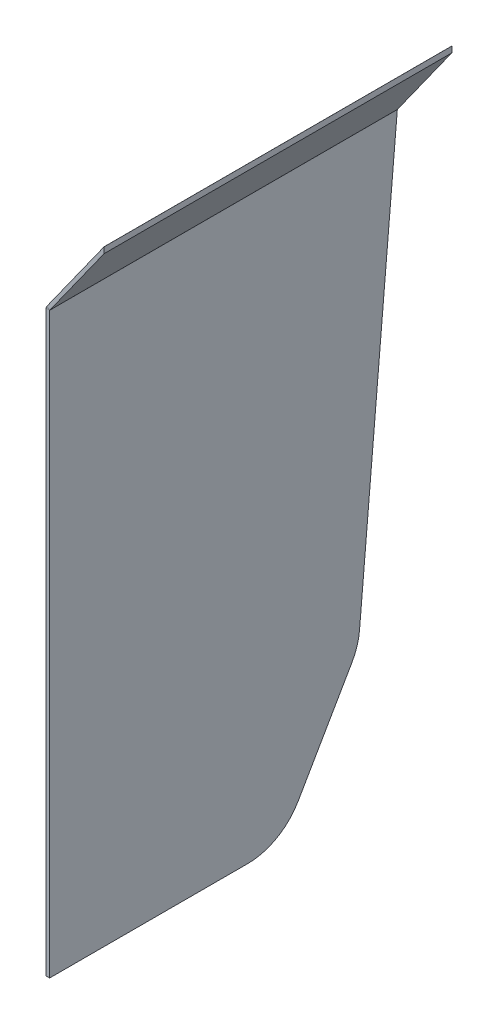
ISO-10303-21;
HEADER;
FILE_DESCRIPTION(('STEP AP214'),'2;1');
FILE_NAME('part.step','',(''),(''),'','','');
FILE_SCHEMA(('AUTOMOTIVE_DESIGN { 1 0 10303 214 1 1 1 1 }'));
ENDSEC;
DATA;
#1=APPLICATION_CONTEXT('core data for automotive mechanical design processes');
#2=APPLICATION_PROTOCOL_DEFINITION('international standard','automotive_design',2000,#1);
#3=PRODUCT_CONTEXT('',#1,'mechanical');
#4=PRODUCT('Part','Part','',(#3));
#5=PRODUCT_RELATED_PRODUCT_CATEGORY('part','',(#4));
#6=PRODUCT_DEFINITION_FORMATION('','',#4);
#7=PRODUCT_DEFINITION_CONTEXT('part definition',#1,'design');
#8=PRODUCT_DEFINITION('design','',#6,#7);
#9=PRODUCT_DEFINITION_SHAPE('','',#8);
#10=(LENGTH_UNIT() NAMED_UNIT(*) SI_UNIT(.MILLI.,.METRE.));
#11=(NAMED_UNIT(*) PLANE_ANGLE_UNIT() SI_UNIT($,.RADIAN.));
#12=(NAMED_UNIT(*) SI_UNIT($,.STERADIAN.) SOLID_ANGLE_UNIT());
#13=UNCERTAINTY_MEASURE_WITH_UNIT(LENGTH_MEASURE(1.E-05),#10,'distance_accuracy_value','');
#14=(GEOMETRIC_REPRESENTATION_CONTEXT(3) GLOBAL_UNCERTAINTY_ASSIGNED_CONTEXT((#13)) GLOBAL_UNIT_ASSIGNED_CONTEXT((#10,
#11,#12)) REPRESENTATION_CONTEXT('',''));
#15=CARTESIAN_POINT('',(0.,0.,0.));
#16=DIRECTION('',(0.,0.,1.));
#17=DIRECTION('',(1.,0.,0.));
#18=AXIS2_PLACEMENT_3D('',#15,#16,#17);
#19=CARTESIAN_POINT('',(0.577426239259121,0.80839673496277,150.));
#20=DIRECTION('',(0.,0.,1.));
#21=DIRECTION('',(1.,0.,0.));
#22=AXIS2_PLACEMENT_3D('',#19,#20,#21);
#23=PLANE('',#22);
#24=DIRECTION('',(0.813733471206735,-0.581238193719096,0.));
#25=VECTOR('',#24,1.);
#26=CARTESIAN_POINT('',(0.577426239259121,0.80839673496277,150.));
#27=LINE('',#26,#25);
#28=CARTESIAN_POINT('',(0.577426239259121,0.80839673496277,150.));
#29=VERTEX_POINT('',#28);
#30=CARTESIAN_POINT('',(3.01862665287933,-0.935317846194519,150.));
#31=VERTEX_POINT('',#30);
#32=EDGE_CURVE('E167',#29,#31,#27,.T.);
#33=ORIENTED_EDGE('',*,*,#32,.F.);
#34=CARTESIAN_POINT('',(3.1,-0.993441665566429,150.));
#35=DIRECTION('',(0.,0.,-1.));
#36=DIRECTION('',(-1.,0.,0.));
#37=AXIS2_PLACEMENT_3D('',#34,#35,#36);
#38=CIRCLE('',#37,3.1);
#39=CARTESIAN_POINT('',(0.,-0.993441665566429,150.));
#40=VERTEX_POINT('',#39);
#41=EDGE_CURVE('E150',#29,#40,#38,.F.);
#42=ORIENTED_EDGE('',*,*,#41,.T.);
#43=DIRECTION('',(-1.,0.,0.));
#44=VECTOR('',#43,1.);
#45=CARTESIAN_POINT('',(3.,-0.993441665566429,150.));
#46=LINE('',#45,#44);
#47=CARTESIAN_POINT('',(3.,-0.993441665566429,150.));
#48=VERTEX_POINT('',#47);
#49=EDGE_CURVE('E164',#48,#40,#46,.T.);
#50=ORIENTED_EDGE('',*,*,#49,.F.);
#51=CARTESIAN_POINT('',(3.1,-0.993441665566429,150.));
#52=DIRECTION('',(0.,0.,1.));
#53=DIRECTION('',(1.,0.,0.));
#54=AXIS2_PLACEMENT_3D('',#51,#52,#53);
#55=CIRCLE('',#54,0.0999999999999998);
#56=EDGE_CURVE('E227',#31,#48,#55,.T.);
#57=ORIENTED_EDGE('',*,*,#56,.F.);
#58=EDGE_LOOP('',(#33,#42,#50,#57));
#59=FACE_BOUND('',#58,.T.);
#60=ADVANCED_FACE('F41',(#59),#23,.T.);
#61=CARTESIAN_POINT('',(3.,-0.993441665566429,150.));
#62=DIRECTION('',(0.,0.,1.));
#63=DIRECTION('',(1.,0.,0.));
#64=AXIS2_PLACEMENT_3D('',#61,#62,#63);
#65=PLANE('',#64);
#66=DIRECTION('',(-0.581238193719096,-0.813733471206735,0.));
#67=VECTOR('',#66,1.);
#68=CARTESIAN_POINT('',(2.44120041362021,-1.74371458115729,150.));
#69=LINE('',#68,#67);
#70=CARTESIAN_POINT('',(49.970938090314,64.7979181662141,150.));
#71=VERTEX_POINT('',#70);
#72=EDGE_CURVE('E230',#71,#31,#69,.T.);
#73=ORIENTED_EDGE('',*,*,#72,.F.);
#74=DIRECTION('',(-0.00938411004951241,-0.999955968269893,0.));
#75=VECTOR('',#74,1.);
#76=CARTESIAN_POINT('',(49.3494355819725,-1.4284090221657,150.));
#77=LINE('',#76,#75);
#78=CARTESIAN_POINT('',(50.019625593432,69.9859817189772,150.));
#79=VERTEX_POINT('',#78);
#80=EDGE_CURVE('E183',#71,#79,#77,.F.);
#81=ORIENTED_EDGE('',*,*,#80,.T.);
#82=DIRECTION('',(0.813733471206744,-0.581238193719083,0.));
#83=VECTOR('',#82,1.);
#84=CARTESIAN_POINT('',(50.,70.,150.));
#85=LINE('',#84,#83);
#86=CARTESIAN_POINT('',(50.,70.,150.));
#87=VERTEX_POINT('',#86);
#88=EDGE_CURVE('E233',#87,#79,#85,.T.);
#89=ORIENTED_EDGE('',*,*,#88,.F.);
#90=DIRECTION('',(-0.581238193719096,-0.813733471206735,0.));
#91=VECTOR('',#90,1.);
#92=CARTESIAN_POINT('',(0.,0.,150.));
#93=LINE('',#92,#91);
#94=EDGE_CURVE('E236',#87,#29,#93,.T.);
#95=ORIENTED_EDGE('',*,*,#94,.T.);
#96=ORIENTED_EDGE('',*,*,#32,.T.);
#97=EDGE_LOOP('',(#73,#81,#89,#95,#96));
#98=FACE_BOUND('',#97,.T.);
#99=ADVANCED_FACE('F271',(#98),#65,.T.);
#100=CARTESIAN_POINT('',(0.,-0.993441665566429,-150.));
#101=DIRECTION('',(0.,0.,-1.));
#102=DIRECTION('',(-1.,0.,0.));
#103=AXIS2_PLACEMENT_3D('',#100,#101,#102);
#104=PLANE('',#103);
#105=DIRECTION('',(1.,0.,0.));
#106=VECTOR('',#105,1.);
#107=CARTESIAN_POINT('',(0.,-0.993441665566429,-150.));
#108=LINE('',#107,#106);
#109=CARTESIAN_POINT('',(0.,-0.993441665566429,-150.));
#110=VERTEX_POINT('',#109);
#111=CARTESIAN_POINT('',(3.00000000000009,-0.993441665566429,-150.));
#112=VERTEX_POINT('',#111);
#113=EDGE_CURVE('E132',#110,#112,#108,.T.);
#114=ORIENTED_EDGE('',*,*,#113,.F.);
#115=CARTESIAN_POINT('',(3.1,-0.993441665566429,-150.));
#116=DIRECTION('',(0.,0.,-1.));
#117=DIRECTION('',(-1.,0.,0.));
#118=AXIS2_PLACEMENT_3D('',#115,#116,#117);
#119=CIRCLE('',#118,3.1);
#120=CARTESIAN_POINT('',(0.577426239259121,0.80839673496277,-150.));
#121=VERTEX_POINT('',#120);
#122=EDGE_CURVE('E153',#121,#110,#119,.F.);
#123=ORIENTED_EDGE('',*,*,#122,.F.);
#124=DIRECTION('',(-0.813733471206735,0.581238193719096,0.));
#125=VECTOR('',#124,1.);
#126=CARTESIAN_POINT('',(3.01862665287933,-0.935317846194519,-150.));
#127=LINE('',#126,#125);
#128=CARTESIAN_POINT('',(3.01862665287933,-0.935317846194519,-150.));
#129=VERTEX_POINT('',#128);
#130=EDGE_CURVE('E165',#129,#121,#127,.T.);
#131=ORIENTED_EDGE('',*,*,#130,.F.);
#132=CARTESIAN_POINT('',(3.1,-0.993441665566429,-150.));
#133=DIRECTION('',(0.,0.,1.));
#134=DIRECTION('',(1.,0.,0.));
#135=AXIS2_PLACEMENT_3D('',#132,#133,#134);
#136=CIRCLE('',#135,0.0999999999999998);
#137=EDGE_CURVE('E163',#129,#112,#136,.T.);
#138=ORIENTED_EDGE('',*,*,#137,.T.);
#139=EDGE_LOOP('',(#114,#123,#131,#138));
#140=FACE_BOUND('',#139,.T.);
#141=ADVANCED_FACE('F161',(#140),#104,.T.);
#142=CARTESIAN_POINT('',(0.,0.,150.));
#143=DIRECTION('',(1.,0.,0.));
#144=DIRECTION('',(0.,1.,0.));
#145=AXIS2_PLACEMENT_3D('',#142,#143,#144);
#146=PLANE('',#145);
#147=DIRECTION('',(0.,0.866025403784436,-0.500000000000004));
#148=VECTOR('',#147,1.);
#149=CARTESIAN_POINT('',(0.,-384.982651285132,-116.405297242007));
#150=LINE('',#149,#148);
#151=CARTESIAN_POINT('',(0.,-475.,-64.4337567297407));
#152=VERTEX_POINT('',#151);
#153=CARTESIAN_POINT('',(0.,-394.582311771742,-110.862930675933));
#154=VERTEX_POINT('',#153);
#155=EDGE_CURVE('E136',#152,#154,#150,.T.);
#156=ORIENTED_EDGE('',*,*,#155,.F.);
#157=CARTESIAN_POINT('',(0.,-450.,-21.1324865405189));
#158=DIRECTION('',(1.,0.,0.));
#159=DIRECTION('',(0.,1.,0.));
#160=AXIS2_PLACEMENT_3D('',#157,#158,#159);
#161=CIRCLE('',#160,50.);
#162=CARTESIAN_POINT('',(0.,-500.,-21.1324865405189));
#163=VERTEX_POINT('',#162);
#164=EDGE_CURVE('E195',#152,#163,#161,.F.);
#165=ORIENTED_EDGE('',*,*,#164,.T.);
#166=DIRECTION('',(0.,0.,-1.));
#167=VECTOR('',#166,1.);
#168=CARTESIAN_POINT('',(0.,-500.,150.));
#169=LINE('',#168,#167);
#170=CARTESIAN_POINT('',(0.,-500.,150.));
#171=VERTEX_POINT('',#170);
#172=EDGE_CURVE('E170',#171,#163,#169,.T.);
#173=ORIENTED_EDGE('',*,*,#172,.F.);
#174=DIRECTION('',(0.,-1.,0.));
#175=VECTOR('',#174,1.);
#176=CARTESIAN_POINT('',(0.,0.,150.));
#177=LINE('',#176,#175);
#178=EDGE_CURVE('E145',#40,#171,#177,.T.);
#179=ORIENTED_EDGE('',*,*,#178,.F.);
#180=DIRECTION('',(0.,0.,-1.));
#181=VECTOR('',#180,1.);
#182=CARTESIAN_POINT('',(0.,-0.993441665566429,150.));
#183=LINE('',#182,#181);
#184=EDGE_CURVE('E139',#40,#110,#183,.T.);
#185=ORIENTED_EDGE('',*,*,#184,.T.);
#186=DIRECTION('',(0.,0.996194698091745,-0.0871557427476618));
#187=VECTOR('',#186,1.);
#188=CARTESIAN_POINT('',(0.,-0.993441665566429,-150.));
#189=LINE('',#188,#187);
#190=CARTESIAN_POINT('',(0.,-373.940098909125,-117.371395391299));
#191=VERTEX_POINT('',#190);
#192=EDGE_CURVE('E128',#191,#110,#189,.T.);
#193=ORIENTED_EDGE('',*,*,#192,.F.);
#194=CARTESIAN_POINT('',(0.,-369.582311771742,-67.5616604867116));
#195=DIRECTION('',(1.,0.,0.));
#196=DIRECTION('',(0.,1.,0.));
#197=AXIS2_PLACEMENT_3D('',#194,#195,#196);
#198=CIRCLE('',#197,50.);
#199=EDGE_CURVE('E193',#191,#154,#198,.F.);
#200=ORIENTED_EDGE('',*,*,#199,.T.);
#201=EDGE_LOOP('',(#156,#165,#173,#179,#185,#193,#200));
#202=FACE_BOUND('',#201,.T.);
#203=ADVANCED_FACE('F142',(#202),#146,.F.);
#204=CARTESIAN_POINT('',(3.00000000000006,-500.,150.));
#205=DIRECTION('',(0.,-1.,0.));
#206=DIRECTION('',(0.,0.,-1.));
#207=AXIS2_PLACEMENT_3D('',#204,#205,#206);
#208=PLANE('',#207);
#209=ORIENTED_EDGE('',*,*,#172,.T.);
#210=DIRECTION('',(-1.,0.,0.));
#211=VECTOR('',#210,1.);
#212=CARTESIAN_POINT('',(3.00000000000011,-500.,-21.1324865405189));
#213=LINE('',#212,#211);
#214=CARTESIAN_POINT('',(3.00000000000006,-500.,-21.1324865405189));
#215=VERTEX_POINT('',#214);
#216=EDGE_CURVE('E198',#163,#215,#213,.F.);
#217=ORIENTED_EDGE('',*,*,#216,.T.);
#218=DIRECTION('',(0.,0.,-1.));
#219=VECTOR('',#218,1.);
#220=CARTESIAN_POINT('',(3.00000000000006,-500.,150.));
#221=LINE('',#220,#219);
#222=CARTESIAN_POINT('',(3.00000000000006,-500.,150.));
#223=VERTEX_POINT('',#222);
#224=EDGE_CURVE('E207',#223,#215,#221,.T.);
#225=ORIENTED_EDGE('',*,*,#224,.F.);
#226=DIRECTION('',(-1.,0.,0.));
#227=VECTOR('',#226,1.);
#228=CARTESIAN_POINT('',(3.00000000000006,-500.,150.));
#229=LINE('',#228,#227);
#230=EDGE_CURVE('E224',#223,#171,#229,.T.);
#231=ORIENTED_EDGE('',*,*,#230,.T.);
#232=EDGE_LOOP('',(#209,#217,#225,#231));
#233=FACE_BOUND('',#232,.T.);
#234=ADVANCED_FACE('F215',(#233),#208,.T.);
#235=CARTESIAN_POINT('',(3.,0.,150.));
#236=DIRECTION('',(1.,0.,0.));
#237=DIRECTION('',(0.,1.,0.));
#238=AXIS2_PLACEMENT_3D('',#235,#236,#237);
#239=PLANE('',#238);
#240=ORIENTED_EDGE('',*,*,#224,.T.);
#241=CARTESIAN_POINT('',(3.00000000000006,-450.,-21.1324865405189));
#242=DIRECTION('',(1.,0.,0.));
#243=DIRECTION('',(0.,1.,0.));
#244=AXIS2_PLACEMENT_3D('',#241,#242,#243);
#245=CIRCLE('',#244,50.);
#246=CARTESIAN_POINT('',(3.00000000000006,-475.,-64.4337567297407));
#247=VERTEX_POINT('',#246);
#248=EDGE_CURVE('E49',#215,#247,#245,.T.);
#249=ORIENTED_EDGE('',*,*,#248,.T.);
#250=DIRECTION('',(0.,-0.866025403784436,0.500000000000004));
#251=VECTOR('',#250,1.);
#252=CARTESIAN_POINT('',(3.00000000000003,-211.602540378446,-216.50635094611));
#253=LINE('',#252,#251);
#254=CARTESIAN_POINT('',(3.00000000000005,-394.582311771742,-110.862930675933));
#255=VERTEX_POINT('',#254);
#256=EDGE_CURVE('E186',#255,#247,#253,.T.);
#257=ORIENTED_EDGE('',*,*,#256,.F.);
#258=CARTESIAN_POINT('',(3.00000000000006,-369.582311771742,-67.5616604867116));
#259=DIRECTION('',(1.,0.,0.));
#260=DIRECTION('',(0.,1.,0.));
#261=AXIS2_PLACEMENT_3D('',#258,#259,#260);
#262=CIRCLE('',#261,50.);
#263=CARTESIAN_POINT('',(3.00000000000005,-373.940098909125,-117.371395391299));
#264=VERTEX_POINT('',#263);
#265=EDGE_CURVE('E201',#255,#264,#262,.T.);
#266=ORIENTED_EDGE('',*,*,#265,.T.);
#267=DIRECTION('',(0.,-0.996194698091745,0.0871557427476618));
#268=VECTOR('',#267,1.);
#269=CARTESIAN_POINT('',(3.,-26.0547729556163,-147.807417619253));
#270=LINE('',#269,#268);
#271=EDGE_CURVE('E135',#112,#264,#270,.T.);
#272=ORIENTED_EDGE('',*,*,#271,.F.);
#273=DIRECTION('',(0.,0.,-1.));
#274=VECTOR('',#273,1.);
#275=CARTESIAN_POINT('',(3.,-0.993441665566429,150.));
#276=LINE('',#275,#274);
#277=EDGE_CURVE('E212',#48,#112,#276,.T.);
#278=ORIENTED_EDGE('',*,*,#277,.F.);
#279=DIRECTION('',(0.,-1.,0.));
#280=VECTOR('',#279,1.);
#281=CARTESIAN_POINT('',(3.,0.,150.));
#282=LINE('',#281,#280);
#283=EDGE_CURVE('E209',#48,#223,#282,.T.);
#284=ORIENTED_EDGE('',*,*,#283,.T.);
#285=EDGE_LOOP('',(#240,#249,#257,#266,#272,#278,#284));
#286=FACE_BOUND('',#285,.T.);
#287=ADVANCED_FACE('F205',(#286),#239,.T.);
#288=CARTESIAN_POINT('',(3.1,-0.993441665566429,150.));
#289=DIRECTION('',(0.,0.,-1.));
#290=DIRECTION('',(-1.,0.,0.));
#291=AXIS2_PLACEMENT_3D('',#288,#289,#290);
#292=CYLINDRICAL_SURFACE('',#291,0.0999999999999998);
#293=ORIENTED_EDGE('',*,*,#137,.F.);
#294=DIRECTION('',(0.,0.,-1.));
#295=VECTOR('',#294,1.);
#296=CARTESIAN_POINT('',(3.01862665287933,-0.935317846194519,150.));
#297=LINE('',#296,#295);
#298=EDGE_CURVE('E252',#31,#129,#297,.T.);
#299=ORIENTED_EDGE('',*,*,#298,.F.);
#300=ORIENTED_EDGE('',*,*,#56,.T.);
#301=ORIENTED_EDGE('',*,*,#277,.T.);
#302=EDGE_LOOP('',(#293,#299,#300,#301));
#303=FACE_BOUND('',#302,.T.);
#304=ADVANCED_FACE('F257',(#303),#292,.F.);
#305=CARTESIAN_POINT('',(2.44120041362021,-1.74371458115729,150.));
#306=DIRECTION('',(0.813733471206735,-0.581238193719096,0.));
#307=DIRECTION('',(0.581238193719096,0.813733471206735,0.));
#308=AXIS2_PLACEMENT_3D('',#305,#306,#307);
#309=PLANE('',#308);
#310=DIRECTION('',(-0.581238193719096,-0.813733471206735,0.));
#311=VECTOR('',#310,1.);
#312=CARTESIAN_POINT('',(2.44120041362021,-1.74371458115729,-150.));
#313=LINE('',#312,#311);
#314=CARTESIAN_POINT('',(49.970938090314,64.7979181662141,-150.));
#315=VERTEX_POINT('',#314);
#316=EDGE_CURVE('E242',#315,#129,#313,.T.);
#317=ORIENTED_EDGE('',*,*,#316,.F.);
#318=DIRECTION('',(0.,0.,1.));
#319=VECTOR('',#318,1.);
#320=CARTESIAN_POINT('',(49.970938090314,64.797918166214,150.));
#321=LINE('',#320,#319);
#322=EDGE_CURVE('E181',#315,#71,#321,.T.);
#323=ORIENTED_EDGE('',*,*,#322,.T.);
#324=ORIENTED_EDGE('',*,*,#72,.T.);
#325=ORIENTED_EDGE('',*,*,#298,.T.);
#326=EDGE_LOOP('',(#317,#323,#324,#325));
#327=FACE_BOUND('',#326,.T.);
#328=ADVANCED_FACE('F297',(#327),#309,.T.);
#329=CARTESIAN_POINT('',(50.,70.,150.));
#330=DIRECTION('',(0.581238193719083,0.813733471206744,0.));
#331=DIRECTION('',(-0.813733471206744,0.581238193719083,0.));
#332=AXIS2_PLACEMENT_3D('',#329,#330,#331);
#333=PLANE('',#332);
#334=ORIENTED_EDGE('',*,*,#88,.T.);
#335=DIRECTION('',(0.,0.,-1.));
#336=VECTOR('',#335,1.);
#337=CARTESIAN_POINT('',(50.019625593432,69.9859817189772,150.));
#338=LINE('',#337,#336);
#339=CARTESIAN_POINT('',(50.019625593432,69.9859817189772,-150.));
#340=VERTEX_POINT('',#339);
#341=EDGE_CURVE('E176',#79,#340,#338,.T.);
#342=ORIENTED_EDGE('',*,*,#341,.T.);
#343=DIRECTION('',(0.813733471206744,-0.581238193719083,0.));
#344=VECTOR('',#343,1.);
#345=CARTESIAN_POINT('',(50.,70.,-150.));
#346=LINE('',#345,#344);
#347=CARTESIAN_POINT('',(50.,70.,-150.));
#348=VERTEX_POINT('',#347);
#349=EDGE_CURVE('E244',#348,#340,#346,.T.);
#350=ORIENTED_EDGE('',*,*,#349,.F.);
#351=DIRECTION('',(0.,0.,-1.));
#352=VECTOR('',#351,1.);
#353=CARTESIAN_POINT('',(50.,70.,150.));
#354=LINE('',#353,#352);
#355=EDGE_CURVE('E249',#87,#348,#354,.T.);
#356=ORIENTED_EDGE('',*,*,#355,.F.);
#357=EDGE_LOOP('',(#334,#342,#350,#356));
#358=FACE_BOUND('',#357,.T.);
#359=ADVANCED_FACE('F308',(#358),#333,.T.);
#360=CARTESIAN_POINT('',(0.,0.,150.));
#361=DIRECTION('',(0.813733471206735,-0.581238193719096,0.));
#362=DIRECTION('',(0.581238193719096,0.813733471206735,0.));
#363=AXIS2_PLACEMENT_3D('',#360,#361,#362);
#364=PLANE('',#363);
#365=DIRECTION('',(-0.581238193719096,-0.813733471206735,0.));
#366=VECTOR('',#365,1.);
#367=CARTESIAN_POINT('',(0.,0.,-150.));
#368=LINE('',#367,#366);
#369=EDGE_CURVE('E158',#348,#121,#368,.T.);
#370=ORIENTED_EDGE('',*,*,#369,.T.);
#371=DIRECTION('',(0.,0.,-1.));
#372=VECTOR('',#371,1.);
#373=CARTESIAN_POINT('',(0.577426239259121,0.80839673496277,150.));
#374=LINE('',#373,#372);
#375=EDGE_CURVE('E149',#29,#121,#374,.T.);
#376=ORIENTED_EDGE('',*,*,#375,.F.);
#377=ORIENTED_EDGE('',*,*,#94,.F.);
#378=ORIENTED_EDGE('',*,*,#355,.T.);
#379=EDGE_LOOP('',(#370,#376,#377,#378));
#380=FACE_BOUND('',#379,.T.);
#381=ADVANCED_FACE('F303',(#380),#364,.F.);
#382=CARTESIAN_POINT('',(3.1,-0.993441665566429,150.));
#383=DIRECTION('',(0.,0.,-1.));
#384=DIRECTION('',(-1.,0.,0.));
#385=AXIS2_PLACEMENT_3D('',#382,#383,#384);
#386=CYLINDRICAL_SURFACE('',#385,3.1);
#387=ORIENTED_EDGE('',*,*,#122,.T.);
#388=ORIENTED_EDGE('',*,*,#184,.F.);
#389=ORIENTED_EDGE('',*,*,#41,.F.);
#390=ORIENTED_EDGE('',*,*,#375,.T.);
#391=EDGE_LOOP('',(#387,#388,#389,#390));
#392=FACE_BOUND('',#391,.T.);
#393=ADVANCED_FACE('F154',(#392),#386,.T.);
#394=CARTESIAN_POINT('',(3.1,-0.993441665566429,150.));
#395=DIRECTION('',(0.,0.,1.));
#396=DIRECTION('',(1.,0.,0.));
#397=AXIS2_PLACEMENT_3D('',#394,#395,#396);
#398=PLANE('',#397);
#399=ORIENTED_EDGE('',*,*,#178,.T.);
#400=ORIENTED_EDGE('',*,*,#230,.F.);
#401=ORIENTED_EDGE('',*,*,#283,.F.);
#402=ORIENTED_EDGE('',*,*,#49,.T.);
#403=EDGE_LOOP('',(#399,#400,#401,#402));
#404=FACE_BOUND('',#403,.T.);
#405=ADVANCED_FACE('F288',(#404),#398,.T.);
#406=CARTESIAN_POINT('',(3.1,-0.993441665566429,-150.));
#407=DIRECTION('',(0.,0.,1.));
#408=DIRECTION('',(1.,0.,0.));
#409=AXIS2_PLACEMENT_3D('',#406,#407,#408);
#410=PLANE('',#409);
#411=ORIENTED_EDGE('',*,*,#349,.T.);
#412=DIRECTION('',(0.00938411004951241,0.999955968269893,0.));
#413=VECTOR('',#412,1.);
#414=CARTESIAN_POINT('',(50.019625593432,69.9859817189772,-150.));
#415=LINE('',#414,#413);
#416=EDGE_CURVE('E179',#340,#315,#415,.F.);
#417=ORIENTED_EDGE('',*,*,#416,.T.);
#418=ORIENTED_EDGE('',*,*,#316,.T.);
#419=ORIENTED_EDGE('',*,*,#130,.T.);
#420=ORIENTED_EDGE('',*,*,#369,.F.);
#421=EDGE_LOOP('',(#411,#417,#418,#419,#420));
#422=FACE_BOUND('',#421,.T.);
#423=ADVANCED_FACE('F283',(#422),#410,.F.);
#424=CARTESIAN_POINT('',(50.019625593432,69.9859817189772,150.));
#425=DIRECTION('',(-0.999955968269893,0.00938411004951241,0.));
#426=DIRECTION('',(0.,0.,-1.));
#427=AXIS2_PLACEMENT_3D('',#424,#425,#426);
#428=PLANE('',#427);
#429=ORIENTED_EDGE('',*,*,#80,.F.);
#430=ORIENTED_EDGE('',*,*,#322,.F.);
#431=ORIENTED_EDGE('',*,*,#416,.F.);
#432=ORIENTED_EDGE('',*,*,#341,.F.);
#433=EDGE_LOOP('',(#429,#430,#431,#432));
#434=FACE_BOUND('',#433,.T.);
#435=ADVANCED_FACE('F267',(#434),#428,.F.);
#436=CARTESIAN_POINT('',(160.,-0.99344166556641,-150.));
#437=DIRECTION('',(0.,0.0871557427476618,0.996194698091745));
#438=DIRECTION('',(0.,-0.996194698091745,0.0871557427476618));
#439=AXIS2_PLACEMENT_3D('',#436,#437,#438);
#440=PLANE('',#439);
#441=ORIENTED_EDGE('',*,*,#271,.T.);
#442=DIRECTION('',(-1.,0.,0.));
#443=VECTOR('',#442,1.);
#444=CARTESIAN_POINT('',(160.,-373.940098909125,-117.371395391299));
#445=LINE('',#444,#443);
#446=EDGE_CURVE('E11',#264,#191,#445,.T.);
#447=ORIENTED_EDGE('',*,*,#446,.T.);
#448=ORIENTED_EDGE('',*,*,#192,.T.);
#449=ORIENTED_EDGE('',*,*,#113,.T.);
#450=EDGE_LOOP('',(#441,#447,#448,#449));
#451=FACE_BOUND('',#450,.T.);
#452=ADVANCED_FACE('F130',(#451),#440,.F.);
#453=CARTESIAN_POINT('',(160.,-384.982651285132,-116.405297242007));
#454=DIRECTION('',(0.,0.500000000000004,0.866025403784436));
#455=DIRECTION('',(0.,-0.866025403784436,0.500000000000004));
#456=AXIS2_PLACEMENT_3D('',#453,#454,#455);
#457=PLANE('',#456);
#458=ORIENTED_EDGE('',*,*,#256,.T.);
#459=DIRECTION('',(-1.,0.,0.));
#460=VECTOR('',#459,1.);
#461=CARTESIAN_POINT('',(0.,-475.,-64.4337567297407));
#462=LINE('',#461,#460);
#463=EDGE_CURVE('E191',#247,#152,#462,.T.);
#464=ORIENTED_EDGE('',*,*,#463,.T.);
#465=ORIENTED_EDGE('',*,*,#155,.T.);
#466=DIRECTION('',(-1.,0.,0.));
#467=VECTOR('',#466,1.);
#468=CARTESIAN_POINT('',(160.,-394.582311771742,-110.862930675933));
#469=LINE('',#468,#467);
#470=EDGE_CURVE('E189',#154,#255,#469,.F.);
#471=ORIENTED_EDGE('',*,*,#470,.T.);
#472=EDGE_LOOP('',(#458,#464,#465,#471));
#473=FACE_BOUND('',#472,.T.);
#474=ADVANCED_FACE('F260',(#473),#457,.F.);
#475=CARTESIAN_POINT('',(160.,-450.,-21.1324865405189));
#476=DIRECTION('',(1.,0.,0.));
#477=DIRECTION('',(0.,0.,-1.));
#478=AXIS2_PLACEMENT_3D('',#475,#476,#477);
#479=CYLINDRICAL_SURFACE('',#478,50.);
#480=ORIENTED_EDGE('',*,*,#248,.F.);
#481=ORIENTED_EDGE('',*,*,#216,.F.);
#482=ORIENTED_EDGE('',*,*,#164,.F.);
#483=ORIENTED_EDGE('',*,*,#463,.F.);
#484=EDGE_LOOP('',(#480,#481,#482,#483));
#485=FACE_BOUND('',#484,.T.);
#486=ADVANCED_FACE('F217',(#485),#479,.T.);
#487=CARTESIAN_POINT('',(160.,-369.582311771742,-67.5616604867116));
#488=DIRECTION('',(-1.,0.,0.));
#489=DIRECTION('',(0.,-1.,0.));
#490=AXIS2_PLACEMENT_3D('',#487,#488,#489);
#491=CYLINDRICAL_SURFACE('',#490,50.);
#492=ORIENTED_EDGE('',*,*,#265,.F.);
#493=ORIENTED_EDGE('',*,*,#470,.F.);
#494=ORIENTED_EDGE('',*,*,#199,.F.);
#495=ORIENTED_EDGE('',*,*,#446,.F.);
#496=EDGE_LOOP('',(#492,#493,#494,#495));
#497=FACE_BOUND('',#496,.T.);
#498=ADVANCED_FACE('F43',(#497),#491,.T.);
#499=CLOSED_SHELL('',(#60,#99,#141,#203,#234,#287,#304,#328,#359,#381,#393,#405,#423,#435,#452,
#474,#486,#498));
#500=MANIFOLD_SOLID_BREP('B2',#499);
#501=ADVANCED_BREP_SHAPE_REPRESENTATION('',(#18,#500),#14);
#502=SHAPE_DEFINITION_REPRESENTATION(#9,#501);
ENDSEC;
END-ISO-10303-21;
